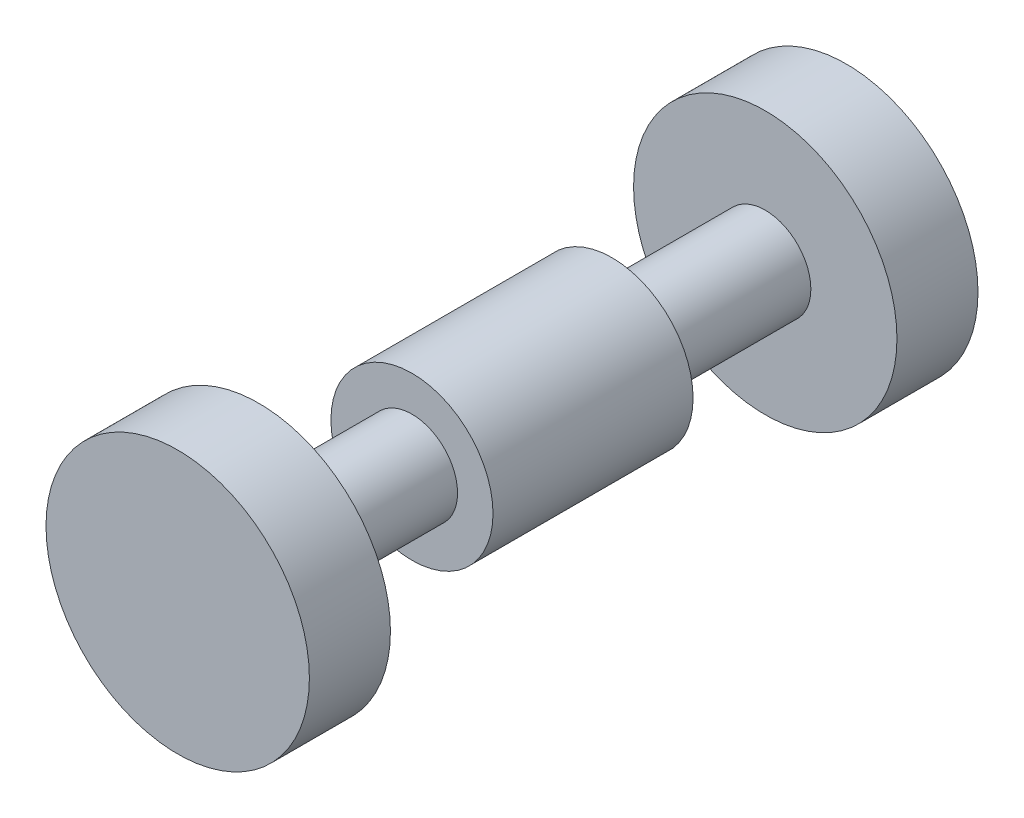
ISO-10303-21;
HEADER;
FILE_DESCRIPTION(('STEP AP214'),'2;1');
FILE_NAME('part.step','',(''),(''),'','','');
FILE_SCHEMA(('AUTOMOTIVE_DESIGN { 1 0 10303 214 1 1 1 1 }'));
ENDSEC;
DATA;
#1=APPLICATION_CONTEXT('core data for automotive mechanical design processes');
#2=APPLICATION_PROTOCOL_DEFINITION('international standard','automotive_design',2000,#1);
#3=PRODUCT_CONTEXT('',#1,'mechanical');
#4=PRODUCT('Part','Part','',(#3));
#5=PRODUCT_RELATED_PRODUCT_CATEGORY('part','',(#4));
#6=PRODUCT_DEFINITION_FORMATION('','',#4);
#7=PRODUCT_DEFINITION_CONTEXT('part definition',#1,'design');
#8=PRODUCT_DEFINITION('design','',#6,#7);
#9=PRODUCT_DEFINITION_SHAPE('','',#8);
#10=(LENGTH_UNIT() NAMED_UNIT(*) SI_UNIT(.MILLI.,.METRE.));
#11=(NAMED_UNIT(*) PLANE_ANGLE_UNIT() SI_UNIT($,.RADIAN.));
#12=(NAMED_UNIT(*) SI_UNIT($,.STERADIAN.) SOLID_ANGLE_UNIT());
#13=UNCERTAINTY_MEASURE_WITH_UNIT(LENGTH_MEASURE(1.E-05),#10,'distance_accuracy_value','');
#14=(GEOMETRIC_REPRESENTATION_CONTEXT(3) GLOBAL_UNCERTAINTY_ASSIGNED_CONTEXT((#13)) GLOBAL_UNIT_ASSIGNED_CONTEXT((#10,
#11,#12)) REPRESENTATION_CONTEXT('',''));
#15=CARTESIAN_POINT('',(0.,0.,0.));
#16=DIRECTION('',(0.,0.,1.));
#17=DIRECTION('',(1.,0.,0.));
#18=AXIS2_PLACEMENT_3D('',#15,#16,#17);
#19=CARTESIAN_POINT('',(0.,0.,5.));
#20=DIRECTION('',(0.,0.,-1.));
#21=DIRECTION('',(-1.,0.,0.));
#22=AXIS2_PLACEMENT_3D('',#19,#20,#21);
#23=CYLINDRICAL_SURFACE('',#22,0.900000000000002);
#24=CARTESIAN_POINT('',(0.,0.,1.975));
#25=DIRECTION('',(0.,0.,1.));
#26=DIRECTION('',(1.,0.,0.));
#27=AXIS2_PLACEMENT_3D('',#24,#25,#26);
#28=CIRCLE('',#27,0.900000000000002);
#29=CARTESIAN_POINT('',(0.900000000000002,0.,1.975));
#30=VERTEX_POINT('',#29);
#31=EDGE_CURVE('E40',#30,#30,#28,.T.);
#32=ORIENTED_EDGE('',*,*,#31,.T.);
#33=EDGE_LOOP('',(#32));
#34=FACE_BOUND('',#33,.T.);
#35=CARTESIAN_POINT('',(0.,0.,5.));
#36=DIRECTION('',(0.,0.,1.));
#37=DIRECTION('',(1.,0.,0.));
#38=AXIS2_PLACEMENT_3D('',#35,#36,#37);
#39=CIRCLE('',#38,0.900000000000002);
#40=CARTESIAN_POINT('',(0.900000000000002,0.,5.));
#41=VERTEX_POINT('',#40);
#42=EDGE_CURVE('E45',#41,#41,#39,.T.);
#43=ORIENTED_EDGE('',*,*,#42,.F.);
#44=EDGE_LOOP('',(#43));
#45=FACE_BOUND('',#44,.T.);
#46=ADVANCED_FACE('F37',(#34,#45),#23,.T.);
#47=CARTESIAN_POINT('',(0.,0.,1.975));
#48=DIRECTION('',(0.,0.,-1.));
#49=DIRECTION('',(-1.,0.,0.));
#50=AXIS2_PLACEMENT_3D('',#47,#48,#49);
#51=CYLINDRICAL_SURFACE('',#50,1.6);
#52=CARTESIAN_POINT('',(0.,0.,1.975));
#53=DIRECTION('',(0.,0.,1.));
#54=DIRECTION('',(1.,0.,0.));
#55=AXIS2_PLACEMENT_3D('',#52,#53,#54);
#56=CIRCLE('',#55,1.6);
#57=CARTESIAN_POINT('',(1.6,0.,1.975));
#58=VERTEX_POINT('',#57);
#59=EDGE_CURVE('E62',#58,#58,#56,.T.);
#60=ORIENTED_EDGE('',*,*,#59,.F.);
#61=EDGE_LOOP('',(#60));
#62=FACE_BOUND('',#61,.T.);
#63=CARTESIAN_POINT('',(0.,0.,-1.975));
#64=DIRECTION('',(0.,0.,1.));
#65=DIRECTION('',(1.,0.,0.));
#66=AXIS2_PLACEMENT_3D('',#63,#64,#65);
#67=CIRCLE('',#66,1.6);
#68=CARTESIAN_POINT('',(1.6,0.,-1.975));
#69=VERTEX_POINT('',#68);
#70=EDGE_CURVE('E58',#69,#69,#67,.T.);
#71=ORIENTED_EDGE('',*,*,#70,.T.);
#72=EDGE_LOOP('',(#71));
#73=FACE_BOUND('',#72,.T.);
#74=ADVANCED_FACE('F97',(#62,#73),#51,.T.);
#75=CARTESIAN_POINT('',(0.,0.,1.975));
#76=DIRECTION('',(0.,0.,1.));
#77=DIRECTION('',(1.,0.,0.));
#78=AXIS2_PLACEMENT_3D('',#75,#76,#77);
#79=PLANE('',#78);
#80=ORIENTED_EDGE('',*,*,#31,.F.);
#81=EDGE_LOOP('',(#80));
#82=FACE_BOUND('',#81,.T.);
#83=ORIENTED_EDGE('',*,*,#59,.T.);
#84=EDGE_LOOP('',(#83));
#85=FACE_BOUND('',#84,.T.);
#86=ADVANCED_FACE('F103',(#82,#85),#79,.T.);
#87=CARTESIAN_POINT('',(0.,0.,-1.975));
#88=DIRECTION('',(0.,0.,1.));
#89=DIRECTION('',(1.,0.,0.));
#90=AXIS2_PLACEMENT_3D('',#87,#88,#89);
#91=PLANE('',#90);
#92=CARTESIAN_POINT('',(0.,0.,-1.975));
#93=DIRECTION('',(0.,0.,1.));
#94=DIRECTION('',(1.,0.,0.));
#95=AXIS2_PLACEMENT_3D('',#92,#93,#94);
#96=CIRCLE('',#95,0.900000000000002);
#97=CARTESIAN_POINT('',(0.900000000000002,0.,-1.975));
#98=VERTEX_POINT('',#97);
#99=EDGE_CURVE('E10',#98,#98,#96,.T.);
#100=ORIENTED_EDGE('',*,*,#99,.T.);
#101=EDGE_LOOP('',(#100));
#102=FACE_BOUND('',#101,.T.);
#103=ORIENTED_EDGE('',*,*,#70,.F.);
#104=EDGE_LOOP('',(#103));
#105=FACE_BOUND('',#104,.T.);
#106=ADVANCED_FACE('F109',(#102,#105),#91,.F.);
#107=CARTESIAN_POINT('',(0.,0.,-5.));
#108=DIRECTION('',(0.,0.,1.));
#109=DIRECTION('',(1.,0.,0.));
#110=AXIS2_PLACEMENT_3D('',#107,#108,#109);
#111=CIRCLE('',#110,0.900000000000002);
#112=CARTESIAN_POINT('',(0.900000000000002,0.,-5.));
#113=VERTEX_POINT('',#112);
#114=EDGE_CURVE('E52',#113,#113,#111,.T.);
#115=ORIENTED_EDGE('',*,*,#114,.T.);
#116=EDGE_LOOP('',(#115));
#117=FACE_BOUND('',#116,.T.);
#118=ORIENTED_EDGE('',*,*,#99,.F.);
#119=EDGE_LOOP('',(#118));
#120=FACE_BOUND('',#119,.T.);
#121=ADVANCED_FACE('F99',(#117,#120),#23,.T.);
#122=CARTESIAN_POINT('',(0.,0.,6.6));
#123=DIRECTION('',(0.,0.,-1.));
#124=DIRECTION('',(-1.,0.,0.));
#125=AXIS2_PLACEMENT_3D('',#122,#123,#124);
#126=CYLINDRICAL_SURFACE('',#125,2.6);
#127=CARTESIAN_POINT('',(0.,0.,6.6));
#128=DIRECTION('',(0.,0.,1.));
#129=DIRECTION('',(1.,0.,0.));
#130=AXIS2_PLACEMENT_3D('',#127,#128,#129);
#131=CIRCLE('',#130,2.6);
#132=CARTESIAN_POINT('',(2.6,0.,6.6));
#133=VERTEX_POINT('',#132);
#134=EDGE_CURVE('E63',#133,#133,#131,.T.);
#135=ORIENTED_EDGE('',*,*,#134,.F.);
#136=EDGE_LOOP('',(#135));
#137=FACE_BOUND('',#136,.T.);
#138=CARTESIAN_POINT('',(0.,0.,5.));
#139=DIRECTION('',(0.,0.,1.));
#140=DIRECTION('',(1.,0.,0.));
#141=AXIS2_PLACEMENT_3D('',#138,#139,#140);
#142=CIRCLE('',#141,2.6);
#143=CARTESIAN_POINT('',(2.6,0.,5.));
#144=VERTEX_POINT('',#143);
#145=EDGE_CURVE('E55',#144,#144,#142,.T.);
#146=ORIENTED_EDGE('',*,*,#145,.T.);
#147=EDGE_LOOP('',(#146));
#148=FACE_BOUND('',#147,.T.);
#149=ADVANCED_FACE('F108',(#137,#148),#126,.T.);
#150=CARTESIAN_POINT('',(0.,0.,6.6));
#151=DIRECTION('',(0.,0.,1.));
#152=DIRECTION('',(1.,0.,0.));
#153=AXIS2_PLACEMENT_3D('',#150,#151,#152);
#154=PLANE('',#153);
#155=ORIENTED_EDGE('',*,*,#134,.T.);
#156=EDGE_LOOP('',(#155));
#157=FACE_BOUND('',#156,.T.);
#158=ADVANCED_FACE('F115',(#157),#154,.T.);
#159=CARTESIAN_POINT('',(0.,0.,5.));
#160=DIRECTION('',(0.,0.,1.));
#161=DIRECTION('',(1.,0.,0.));
#162=AXIS2_PLACEMENT_3D('',#159,#160,#161);
#163=PLANE('',#162);
#164=ORIENTED_EDGE('',*,*,#42,.T.);
#165=EDGE_LOOP('',(#164));
#166=FACE_BOUND('',#165,.T.);
#167=ORIENTED_EDGE('',*,*,#145,.F.);
#168=EDGE_LOOP('',(#167));
#169=FACE_BOUND('',#168,.T.);
#170=ADVANCED_FACE('F94',(#166,#169),#163,.F.);
#171=CARTESIAN_POINT('',(0.,0.,-6.6));
#172=DIRECTION('',(0.,0.,1.));
#173=DIRECTION('',(1.,0.,0.));
#174=AXIS2_PLACEMENT_3D('',#171,#172,#173);
#175=CYLINDRICAL_SURFACE('',#174,2.6);
#176=CARTESIAN_POINT('',(0.,0.,-6.6));
#177=DIRECTION('',(0.,0.,1.));
#178=DIRECTION('',(1.,0.,0.));
#179=AXIS2_PLACEMENT_3D('',#176,#177,#178);
#180=CIRCLE('',#179,2.6);
#181=CARTESIAN_POINT('',(2.6,0.,-6.6));
#182=VERTEX_POINT('',#181);
#183=EDGE_CURVE('E56',#182,#182,#180,.T.);
#184=ORIENTED_EDGE('',*,*,#183,.T.);
#185=EDGE_LOOP('',(#184));
#186=FACE_BOUND('',#185,.T.);
#187=CARTESIAN_POINT('',(0.,0.,-5.));
#188=DIRECTION('',(0.,0.,1.));
#189=DIRECTION('',(1.,0.,0.));
#190=AXIS2_PLACEMENT_3D('',#187,#188,#189);
#191=CIRCLE('',#190,2.6);
#192=CARTESIAN_POINT('',(2.6,0.,-5.));
#193=VERTEX_POINT('',#192);
#194=EDGE_CURVE('E73',#193,#193,#191,.T.);
#195=ORIENTED_EDGE('',*,*,#194,.F.);
#196=EDGE_LOOP('',(#195));
#197=FACE_BOUND('',#196,.T.);
#198=ADVANCED_FACE('F81',(#186,#197),#175,.T.);
#199=CARTESIAN_POINT('',(0.,0.,-6.6));
#200=DIRECTION('',(0.,0.,-1.));
#201=DIRECTION('',(1.,0.,0.));
#202=AXIS2_PLACEMENT_3D('',#199,#200,#201);
#203=PLANE('',#202);
#204=ORIENTED_EDGE('',*,*,#183,.F.);
#205=EDGE_LOOP('',(#204));
#206=FACE_BOUND('',#205,.T.);
#207=ADVANCED_FACE('F84',(#206),#203,.T.);
#208=CARTESIAN_POINT('',(0.,0.,-5.));
#209=DIRECTION('',(0.,0.,-1.));
#210=DIRECTION('',(1.,0.,0.));
#211=AXIS2_PLACEMENT_3D('',#208,#209,#210);
#212=PLANE('',#211);
#213=ORIENTED_EDGE('',*,*,#114,.F.);
#214=EDGE_LOOP('',(#213));
#215=FACE_BOUND('',#214,.T.);
#216=ORIENTED_EDGE('',*,*,#194,.T.);
#217=EDGE_LOOP('',(#216));
#218=FACE_BOUND('',#217,.T.);
#219=ADVANCED_FACE('F86',(#215,#218),#212,.F.);
#220=CLOSED_SHELL('',(#46,#74,#86,#106,#121,#149,#158,#170,#198,#207,#219));
#221=MANIFOLD_SOLID_BREP('B2',#220);
#222=ADVANCED_BREP_SHAPE_REPRESENTATION('',(#18,#221),#14);
#223=SHAPE_DEFINITION_REPRESENTATION(#9,#222);
ENDSEC;
END-ISO-10303-21;
